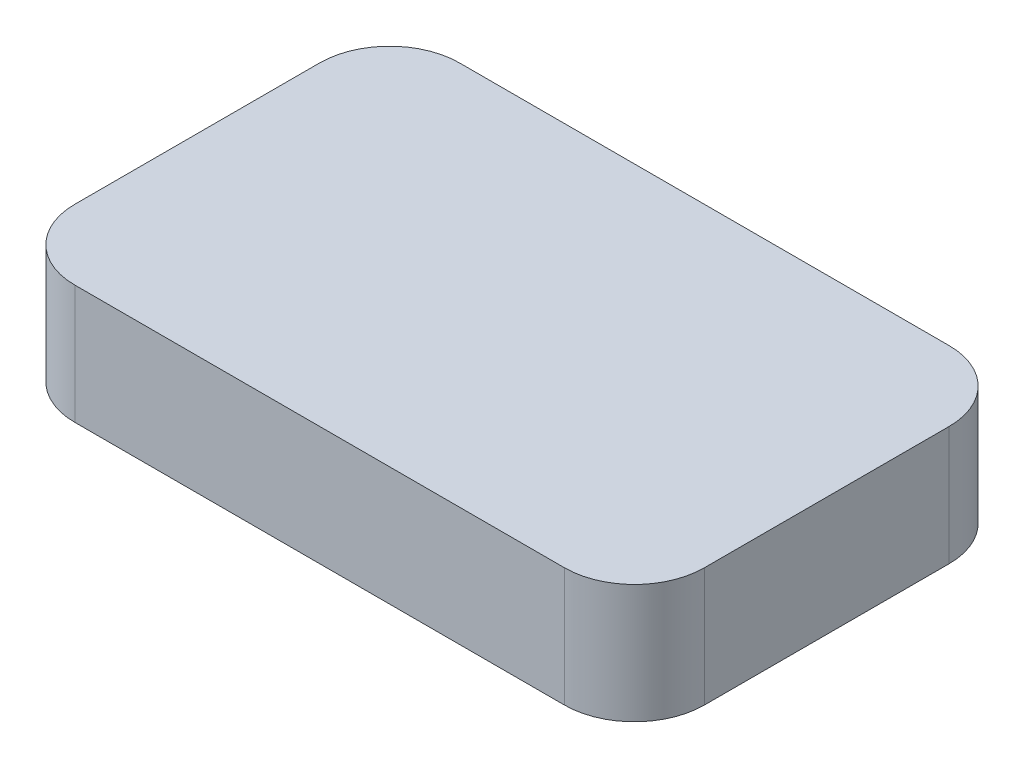
ISO-10303-21;
HEADER;
FILE_DESCRIPTION(('STEP AP214'),'2;1');
FILE_NAME('part.step','',(''),(''),'','','');
FILE_SCHEMA(('AUTOMOTIVE_DESIGN { 1 0 10303 214 1 1 1 1 }'));
ENDSEC;
DATA;
#1=APPLICATION_CONTEXT('core data for automotive mechanical design processes');
#2=APPLICATION_PROTOCOL_DEFINITION('international standard','automotive_design',2000,#1);
#3=PRODUCT_CONTEXT('',#1,'mechanical');
#4=PRODUCT('Part','Part','',(#3));
#5=PRODUCT_RELATED_PRODUCT_CATEGORY('part','',(#4));
#6=PRODUCT_DEFINITION_FORMATION('','',#4);
#7=PRODUCT_DEFINITION_CONTEXT('part definition',#1,'design');
#8=PRODUCT_DEFINITION('design','',#6,#7);
#9=PRODUCT_DEFINITION_SHAPE('','',#8);
#10=(LENGTH_UNIT() NAMED_UNIT(*) SI_UNIT(.MILLI.,.METRE.));
#11=(NAMED_UNIT(*) PLANE_ANGLE_UNIT() SI_UNIT($,.RADIAN.));
#12=(NAMED_UNIT(*) SI_UNIT($,.STERADIAN.) SOLID_ANGLE_UNIT());
#13=UNCERTAINTY_MEASURE_WITH_UNIT(LENGTH_MEASURE(1.E-05),#10,'distance_accuracy_value','');
#14=(GEOMETRIC_REPRESENTATION_CONTEXT(3) GLOBAL_UNCERTAINTY_ASSIGNED_CONTEXT((#13)) GLOBAL_UNIT_ASSIGNED_CONTEXT((#10,
#11,#12)) REPRESENTATION_CONTEXT('',''));
#15=CARTESIAN_POINT('',(0.,0.,0.));
#16=DIRECTION('',(0.,0.,1.));
#17=DIRECTION('',(1.,0.,0.));
#18=AXIS2_PLACEMENT_3D('',#15,#16,#17);
#19=CARTESIAN_POINT('',(35.,17.,-17.5));
#20=DIRECTION('',(0.,-1.,0.));
#21=DIRECTION('',(0.,0.,-1.));
#22=AXIS2_PLACEMENT_3D('',#19,#20,#21);
#23=CYLINDRICAL_SURFACE('',#22,10.);
#24=CARTESIAN_POINT('',(35.,0.,-17.5));
#25=DIRECTION('',(0.,1.,0.));
#26=DIRECTION('',(0.,0.,-1.));
#27=AXIS2_PLACEMENT_3D('',#24,#25,#26);
#28=CIRCLE('',#27,10.);
#29=CARTESIAN_POINT('',(45.,0.,-17.5));
#30=VERTEX_POINT('',#29);
#31=CARTESIAN_POINT('',(35.,0.,-27.5));
#32=VERTEX_POINT('',#31);
#33=EDGE_CURVE('E151',#30,#32,#28,.T.);
#34=ORIENTED_EDGE('',*,*,#33,.T.);
#35=DIRECTION('',(0.,-1.,0.));
#36=VECTOR('',#35,1.);
#37=CARTESIAN_POINT('',(35.,17.,-27.5));
#38=LINE('',#37,#36);
#39=CARTESIAN_POINT('',(35.,17.,-27.5));
#40=VERTEX_POINT('',#39);
#41=EDGE_CURVE('E11',#40,#32,#38,.T.);
#42=ORIENTED_EDGE('',*,*,#41,.F.);
#43=CARTESIAN_POINT('',(35.,17.,-17.5));
#44=DIRECTION('',(0.,1.,0.));
#45=DIRECTION('',(0.,0.,-1.));
#46=AXIS2_PLACEMENT_3D('',#43,#44,#45);
#47=CIRCLE('',#46,10.);
#48=CARTESIAN_POINT('',(45.,17.,-17.5));
#49=VERTEX_POINT('',#48);
#50=EDGE_CURVE('E172',#49,#40,#47,.T.);
#51=ORIENTED_EDGE('',*,*,#50,.F.);
#52=DIRECTION('',(0.,-1.,0.));
#53=VECTOR('',#52,1.);
#54=CARTESIAN_POINT('',(45.,17.,-17.5));
#55=LINE('',#54,#53);
#56=EDGE_CURVE('E147',#49,#30,#55,.T.);
#57=ORIENTED_EDGE('',*,*,#56,.T.);
#58=EDGE_LOOP('',(#34,#42,#51,#57));
#59=FACE_BOUND('',#58,.T.);
#60=ADVANCED_FACE('F42',(#59),#23,.T.);
#61=CARTESIAN_POINT('',(-35.,17.,-27.5));
#62=DIRECTION('',(0.,0.,1.));
#63=DIRECTION('',(1.,0.,0.));
#64=AXIS2_PLACEMENT_3D('',#61,#62,#63);
#65=PLANE('',#64);
#66=DIRECTION('',(-1.,0.,0.));
#67=VECTOR('',#66,1.);
#68=CARTESIAN_POINT('',(-35.,0.,-27.5));
#69=LINE('',#68,#67);
#70=CARTESIAN_POINT('',(-35.,0.,-27.5));
#71=VERTEX_POINT('',#70);
#72=EDGE_CURVE('E155',#32,#71,#69,.T.);
#73=ORIENTED_EDGE('',*,*,#72,.T.);
#74=DIRECTION('',(0.,-1.,0.));
#75=VECTOR('',#74,1.);
#76=CARTESIAN_POINT('',(-35.,17.,-27.5));
#77=LINE('',#76,#75);
#78=CARTESIAN_POINT('',(-35.,17.,-27.5));
#79=VERTEX_POINT('',#78);
#80=EDGE_CURVE('E51',#79,#71,#77,.T.);
#81=ORIENTED_EDGE('',*,*,#80,.F.);
#82=DIRECTION('',(-1.,0.,0.));
#83=VECTOR('',#82,1.);
#84=CARTESIAN_POINT('',(-35.,17.,-27.5));
#85=LINE('',#84,#83);
#86=EDGE_CURVE('E109',#40,#79,#85,.T.);
#87=ORIENTED_EDGE('',*,*,#86,.F.);
#88=ORIENTED_EDGE('',*,*,#41,.T.);
#89=EDGE_LOOP('',(#73,#81,#87,#88));
#90=FACE_BOUND('',#89,.T.);
#91=ADVANCED_FACE('F217',(#90),#65,.F.);
#92=CARTESIAN_POINT('',(-35.,17.,-17.5));
#93=DIRECTION('',(0.,-1.,0.));
#94=DIRECTION('',(0.,0.,-1.));
#95=AXIS2_PLACEMENT_3D('',#92,#93,#94);
#96=CYLINDRICAL_SURFACE('',#95,10.);
#97=CARTESIAN_POINT('',(-35.,0.,-17.5));
#98=DIRECTION('',(0.,1.,0.));
#99=DIRECTION('',(0.,0.,-1.));
#100=AXIS2_PLACEMENT_3D('',#97,#98,#99);
#101=CIRCLE('',#100,10.);
#102=CARTESIAN_POINT('',(-45.,0.,-17.5));
#103=VERTEX_POINT('',#102);
#104=EDGE_CURVE('E158',#71,#103,#101,.T.);
#105=ORIENTED_EDGE('',*,*,#104,.T.);
#106=DIRECTION('',(0.,-1.,0.));
#107=VECTOR('',#106,1.);
#108=CARTESIAN_POINT('',(-45.,17.,-17.5));
#109=LINE('',#108,#107);
#110=CARTESIAN_POINT('',(-45.,17.,-17.5));
#111=VERTEX_POINT('',#110);
#112=EDGE_CURVE('E183',#111,#103,#109,.T.);
#113=ORIENTED_EDGE('',*,*,#112,.F.);
#114=CARTESIAN_POINT('',(-35.,17.,-17.5));
#115=DIRECTION('',(0.,1.,0.));
#116=DIRECTION('',(0.,0.,-1.));
#117=AXIS2_PLACEMENT_3D('',#114,#115,#116);
#118=CIRCLE('',#117,10.);
#119=EDGE_CURVE('E194',#79,#111,#118,.T.);
#120=ORIENTED_EDGE('',*,*,#119,.F.);
#121=ORIENTED_EDGE('',*,*,#80,.T.);
#122=EDGE_LOOP('',(#105,#113,#120,#121));
#123=FACE_BOUND('',#122,.T.);
#124=ADVANCED_FACE('F192',(#123),#96,.T.);
#125=CARTESIAN_POINT('',(-45.,17.,-17.5));
#126=DIRECTION('',(1.,0.,0.));
#127=DIRECTION('',(0.,0.,-1.));
#128=AXIS2_PLACEMENT_3D('',#125,#126,#127);
#129=PLANE('',#128);
#130=DIRECTION('',(0.,0.,1.));
#131=VECTOR('',#130,1.);
#132=CARTESIAN_POINT('',(-45.,0.,-17.5));
#133=LINE('',#132,#131);
#134=CARTESIAN_POINT('',(-45.,0.,17.5));
#135=VERTEX_POINT('',#134);
#136=EDGE_CURVE('E161',#103,#135,#133,.T.);
#137=ORIENTED_EDGE('',*,*,#136,.T.);
#138=DIRECTION('',(0.,-1.,0.));
#139=VECTOR('',#138,1.);
#140=CARTESIAN_POINT('',(-45.,17.,17.5));
#141=LINE('',#140,#139);
#142=CARTESIAN_POINT('',(-45.,17.,17.5));
#143=VERTEX_POINT('',#142);
#144=EDGE_CURVE('E179',#143,#135,#141,.T.);
#145=ORIENTED_EDGE('',*,*,#144,.F.);
#146=DIRECTION('',(0.,0.,1.));
#147=VECTOR('',#146,1.);
#148=CARTESIAN_POINT('',(-45.,17.,-17.5));
#149=LINE('',#148,#147);
#150=EDGE_CURVE('E207',#111,#143,#149,.T.);
#151=ORIENTED_EDGE('',*,*,#150,.F.);
#152=ORIENTED_EDGE('',*,*,#112,.T.);
#153=EDGE_LOOP('',(#137,#145,#151,#152));
#154=FACE_BOUND('',#153,.T.);
#155=ADVANCED_FACE('F202',(#154),#129,.F.);
#156=CARTESIAN_POINT('',(-35.,17.,17.5));
#157=DIRECTION('',(0.,-1.,0.));
#158=DIRECTION('',(0.,0.,-1.));
#159=AXIS2_PLACEMENT_3D('',#156,#157,#158);
#160=CYLINDRICAL_SURFACE('',#159,10.);
#161=CARTESIAN_POINT('',(-35.,0.,17.5));
#162=DIRECTION('',(0.,1.,0.));
#163=DIRECTION('',(0.,0.,-1.));
#164=AXIS2_PLACEMENT_3D('',#161,#162,#163);
#165=CIRCLE('',#164,10.);
#166=CARTESIAN_POINT('',(-35.,0.,27.5));
#167=VERTEX_POINT('',#166);
#168=EDGE_CURVE('E164',#135,#167,#165,.T.);
#169=ORIENTED_EDGE('',*,*,#168,.T.);
#170=DIRECTION('',(0.,-1.,0.));
#171=VECTOR('',#170,1.);
#172=CARTESIAN_POINT('',(-35.,17.,27.5));
#173=LINE('',#172,#171);
#174=CARTESIAN_POINT('',(-35.,17.,27.5));
#175=VERTEX_POINT('',#174);
#176=EDGE_CURVE('E141',#175,#167,#173,.T.);
#177=ORIENTED_EDGE('',*,*,#176,.F.);
#178=CARTESIAN_POINT('',(-35.,17.,17.5));
#179=DIRECTION('',(0.,1.,0.));
#180=DIRECTION('',(0.,0.,-1.));
#181=AXIS2_PLACEMENT_3D('',#178,#179,#180);
#182=CIRCLE('',#181,10.);
#183=EDGE_CURVE('E131',#143,#175,#182,.T.);
#184=ORIENTED_EDGE('',*,*,#183,.F.);
#185=ORIENTED_EDGE('',*,*,#144,.T.);
#186=EDGE_LOOP('',(#169,#177,#184,#185));
#187=FACE_BOUND('',#186,.T.);
#188=ADVANCED_FACE('F205',(#187),#160,.T.);
#189=CARTESIAN_POINT('',(-35.,17.,27.5));
#190=DIRECTION('',(0.,0.,-1.));
#191=DIRECTION('',(-1.,0.,0.));
#192=AXIS2_PLACEMENT_3D('',#189,#190,#191);
#193=PLANE('',#192);
#194=DIRECTION('',(1.,0.,0.));
#195=VECTOR('',#194,1.);
#196=CARTESIAN_POINT('',(-35.,0.,27.5));
#197=LINE('',#196,#195);
#198=CARTESIAN_POINT('',(35.,0.,27.5));
#199=VERTEX_POINT('',#198);
#200=EDGE_CURVE('E140',#167,#199,#197,.T.);
#201=ORIENTED_EDGE('',*,*,#200,.T.);
#202=DIRECTION('',(0.,-1.,0.));
#203=VECTOR('',#202,1.);
#204=CARTESIAN_POINT('',(35.,17.,27.5));
#205=LINE('',#204,#203);
#206=CARTESIAN_POINT('',(35.,17.,27.5));
#207=VERTEX_POINT('',#206);
#208=EDGE_CURVE('E137',#207,#199,#205,.T.);
#209=ORIENTED_EDGE('',*,*,#208,.F.);
#210=DIRECTION('',(1.,0.,0.));
#211=VECTOR('',#210,1.);
#212=CARTESIAN_POINT('',(-35.,17.,27.5));
#213=LINE('',#212,#211);
#214=EDGE_CURVE('E125',#175,#207,#213,.T.);
#215=ORIENTED_EDGE('',*,*,#214,.F.);
#216=ORIENTED_EDGE('',*,*,#176,.T.);
#217=EDGE_LOOP('',(#201,#209,#215,#216));
#218=FACE_BOUND('',#217,.T.);
#219=ADVANCED_FACE('F138',(#218),#193,.F.);
#220=CARTESIAN_POINT('',(35.,17.,17.5));
#221=DIRECTION('',(0.,-1.,0.));
#222=DIRECTION('',(0.,0.,-1.));
#223=AXIS2_PLACEMENT_3D('',#220,#221,#222);
#224=CYLINDRICAL_SURFACE('',#223,10.);
#225=CARTESIAN_POINT('',(35.,0.,17.5));
#226=DIRECTION('',(0.,1.,0.));
#227=DIRECTION('',(0.,0.,-1.));
#228=AXIS2_PLACEMENT_3D('',#225,#226,#227);
#229=CIRCLE('',#228,10.);
#230=CARTESIAN_POINT('',(45.,0.,17.5));
#231=VERTEX_POINT('',#230);
#232=EDGE_CURVE('E93',#199,#231,#229,.T.);
#233=ORIENTED_EDGE('',*,*,#232,.T.);
#234=DIRECTION('',(0.,-1.,0.));
#235=VECTOR('',#234,1.);
#236=CARTESIAN_POINT('',(45.,17.,17.5));
#237=LINE('',#236,#235);
#238=CARTESIAN_POINT('',(45.,17.,17.5));
#239=VERTEX_POINT('',#238);
#240=EDGE_CURVE('E142',#239,#231,#237,.T.);
#241=ORIENTED_EDGE('',*,*,#240,.F.);
#242=CARTESIAN_POINT('',(35.,17.,17.5));
#243=DIRECTION('',(0.,1.,0.));
#244=DIRECTION('',(0.,0.,-1.));
#245=AXIS2_PLACEMENT_3D('',#242,#243,#244);
#246=CIRCLE('',#245,10.);
#247=EDGE_CURVE('E129',#207,#239,#246,.T.);
#248=ORIENTED_EDGE('',*,*,#247,.F.);
#249=ORIENTED_EDGE('',*,*,#208,.T.);
#250=EDGE_LOOP('',(#233,#241,#248,#249));
#251=FACE_BOUND('',#250,.T.);
#252=ADVANCED_FACE('F144',(#251),#224,.T.);
#253=CARTESIAN_POINT('',(45.,17.,-17.5));
#254=DIRECTION('',(-1.,0.,0.));
#255=DIRECTION('',(0.,0.,1.));
#256=AXIS2_PLACEMENT_3D('',#253,#254,#255);
#257=PLANE('',#256);
#258=DIRECTION('',(0.,0.,-1.));
#259=VECTOR('',#258,1.);
#260=CARTESIAN_POINT('',(45.,0.,-17.5));
#261=LINE('',#260,#259);
#262=EDGE_CURVE('E101',#231,#30,#261,.T.);
#263=ORIENTED_EDGE('',*,*,#262,.T.);
#264=ORIENTED_EDGE('',*,*,#56,.F.);
#265=DIRECTION('',(0.,0.,-1.));
#266=VECTOR('',#265,1.);
#267=CARTESIAN_POINT('',(45.,17.,-17.5));
#268=LINE('',#267,#266);
#269=EDGE_CURVE('E59',#239,#49,#268,.T.);
#270=ORIENTED_EDGE('',*,*,#269,.F.);
#271=ORIENTED_EDGE('',*,*,#240,.T.);
#272=EDGE_LOOP('',(#263,#264,#270,#271));
#273=FACE_BOUND('',#272,.T.);
#274=ADVANCED_FACE('F234',(#273),#257,.F.);
#275=CARTESIAN_POINT('',(35.,17.,-17.5));
#276=DIRECTION('',(0.,-1.,0.));
#277=DIRECTION('',(0.,0.,-1.));
#278=AXIS2_PLACEMENT_3D('',#275,#276,#277);
#279=PLANE('',#278);
#280=ORIENTED_EDGE('',*,*,#50,.T.);
#281=ORIENTED_EDGE('',*,*,#86,.T.);
#282=ORIENTED_EDGE('',*,*,#119,.T.);
#283=ORIENTED_EDGE('',*,*,#150,.T.);
#284=ORIENTED_EDGE('',*,*,#183,.T.);
#285=ORIENTED_EDGE('',*,*,#214,.T.);
#286=ORIENTED_EDGE('',*,*,#247,.T.);
#287=ORIENTED_EDGE('',*,*,#269,.T.);
#288=EDGE_LOOP('',(#280,#281,#282,#283,#284,#285,#286,#287));
#289=FACE_BOUND('',#288,.T.);
#290=ADVANCED_FACE('F127',(#289),#279,.F.);
#291=CARTESIAN_POINT('',(35.,0.,-17.5));
#292=DIRECTION('',(0.,-1.,0.));
#293=DIRECTION('',(0.,0.,-1.));
#294=AXIS2_PLACEMENT_3D('',#291,#292,#293);
#295=PLANE('',#294);
#296=ORIENTED_EDGE('',*,*,#33,.F.);
#297=ORIENTED_EDGE('',*,*,#262,.F.);
#298=ORIENTED_EDGE('',*,*,#232,.F.);
#299=ORIENTED_EDGE('',*,*,#200,.F.);
#300=ORIENTED_EDGE('',*,*,#168,.F.);
#301=ORIENTED_EDGE('',*,*,#136,.F.);
#302=ORIENTED_EDGE('',*,*,#104,.F.);
#303=ORIENTED_EDGE('',*,*,#72,.F.);
#304=EDGE_LOOP('',(#296,#297,#298,#299,#300,#301,#302,#303));
#305=FACE_BOUND('',#304,.T.);
#306=ADVANCED_FACE('F198',(#305),#295,.T.);
#307=CLOSED_SHELL('',(#60,#91,#124,#155,#188,#219,#252,#274,#290,#306));
#308=MANIFOLD_SOLID_BREP('B2',#307);
#309=ADVANCED_BREP_SHAPE_REPRESENTATION('',(#18,#308),#14);
#310=SHAPE_DEFINITION_REPRESENTATION(#9,#309);
ENDSEC;
END-ISO-10303-21;
